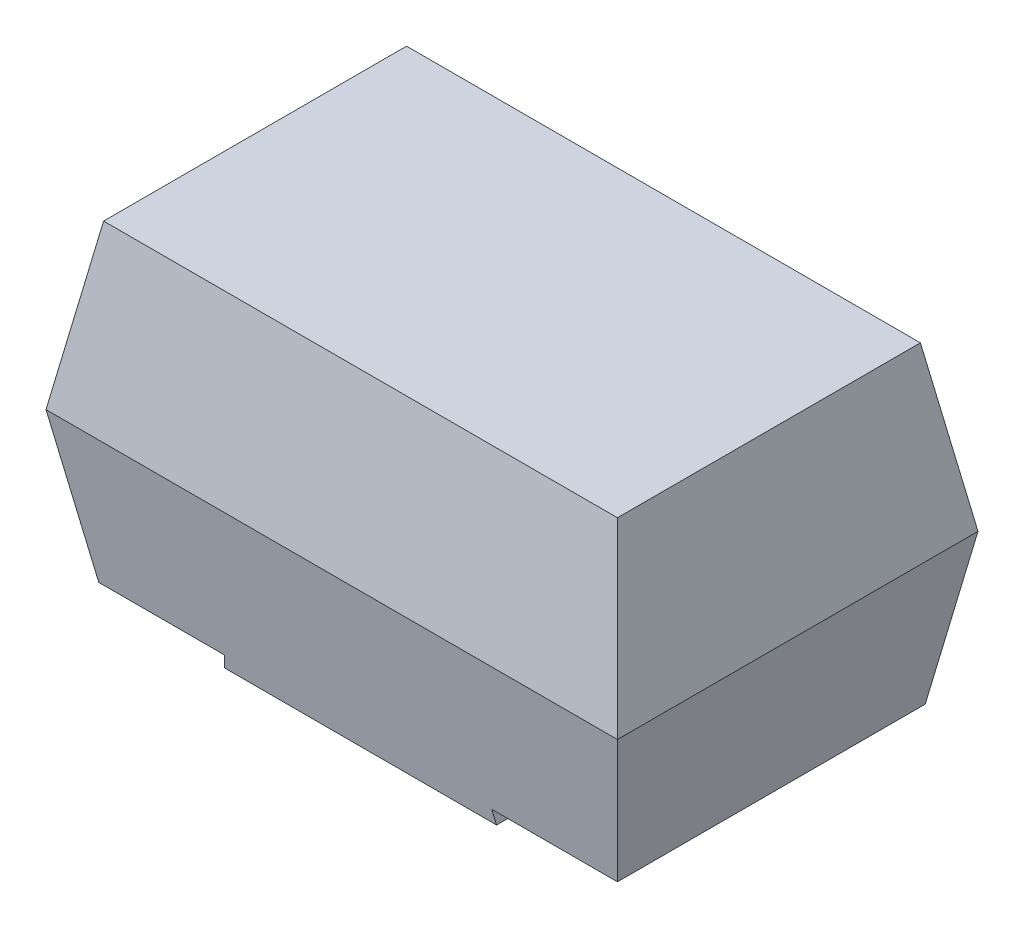
ISO-10303-21;
HEADER;
FILE_DESCRIPTION(('STEP AP214'),'2;1');
FILE_NAME('part.step','',(''),(''),'','','');
FILE_SCHEMA(('AUTOMOTIVE_DESIGN { 1 0 10303 214 1 1 1 1 }'));
ENDSEC;
DATA;
#1=APPLICATION_CONTEXT('core data for automotive mechanical design processes');
#2=APPLICATION_PROTOCOL_DEFINITION('international standard','automotive_design',2000,#1);
#3=PRODUCT_CONTEXT('',#1,'mechanical');
#4=PRODUCT('Part','Part','',(#3));
#5=PRODUCT_RELATED_PRODUCT_CATEGORY('part','',(#4));
#6=PRODUCT_DEFINITION_FORMATION('','',#4);
#7=PRODUCT_DEFINITION_CONTEXT('part definition',#1,'design');
#8=PRODUCT_DEFINITION('design','',#6,#7);
#9=PRODUCT_DEFINITION_SHAPE('','',#8);
#10=(LENGTH_UNIT() NAMED_UNIT(*) SI_UNIT(.MILLI.,.METRE.));
#11=(NAMED_UNIT(*) PLANE_ANGLE_UNIT() SI_UNIT($,.RADIAN.));
#12=(NAMED_UNIT(*) SI_UNIT($,.STERADIAN.) SOLID_ANGLE_UNIT());
#13=UNCERTAINTY_MEASURE_WITH_UNIT(LENGTH_MEASURE(1.E-05),#10,'distance_accuracy_value','');
#14=(GEOMETRIC_REPRESENTATION_CONTEXT(3) GLOBAL_UNCERTAINTY_ASSIGNED_CONTEXT((#13)) GLOBAL_UNIT_ASSIGNED_CONTEXT((#10,
#11,#12)) REPRESENTATION_CONTEXT('',''));
#15=CARTESIAN_POINT('',(0.,0.,0.));
#16=DIRECTION('',(0.,0.,1.));
#17=DIRECTION('',(1.,0.,0.));
#18=AXIS2_PLACEMENT_3D('',#15,#16,#17);
#19=CARTESIAN_POINT('',(0.,0.,0.));
#20=DIRECTION('',(-0.984807753012208,-0.173648177666931,0.));
#21=DIRECTION('',(0.173648177666931,-0.984807753012208,0.));
#22=AXIS2_PLACEMENT_3D('',#19,#20,#21);
#23=PLANE('',#22);
#24=DIRECTION('',(-0.171087869746036,0.970287525247814,-0.171087869746036));
#25=VECTOR('',#24,1.);
#26=CARTESIAN_POINT('',(0.,0.,-2.65));
#27=LINE('',#26,#25);
#28=CARTESIAN_POINT('',(0.193959678779312,-1.1,-2.45604032122069));
#29=VERTEX_POINT('',#28);
#30=CARTESIAN_POINT('',(0.,0.,-2.65));
#31=VERTEX_POINT('',#30);
#32=EDGE_CURVE('E11',#29,#31,#27,.T.);
#33=ORIENTED_EDGE('',*,*,#32,.F.);
#34=DIRECTION('',(0.,0.,-1.));
#35=VECTOR('',#34,1.);
#36=CARTESIAN_POINT('',(0.193959678779312,-1.1,-0.211592376850158));
#37=LINE('',#36,#35);
#38=CARTESIAN_POINT('',(0.193959678779312,-1.1,-0.193959678779312));
#39=VERTEX_POINT('',#38);
#40=EDGE_CURVE('E23',#39,#29,#37,.T.);
#41=ORIENTED_EDGE('',*,*,#40,.F.);
#42=DIRECTION('',(-0.171087869746036,0.970287525247814,0.171087869746036));
#43=VECTOR('',#42,1.);
#44=CARTESIAN_POINT('',(0.,0.,0.));
#45=LINE('',#44,#43);
#46=CARTESIAN_POINT('',(0.,0.,0.));
#47=VERTEX_POINT('',#46);
#48=EDGE_CURVE('E179',#39,#47,#45,.T.);
#49=ORIENTED_EDGE('',*,*,#48,.T.);
#50=DIRECTION('',(0.,0.,1.));
#51=VECTOR('',#50,1.);
#52=CARTESIAN_POINT('',(0.,0.,0.));
#53=LINE('',#52,#51);
#54=EDGE_CURVE('E176',#31,#47,#53,.T.);
#55=ORIENTED_EDGE('',*,*,#54,.F.);
#56=EDGE_LOOP('',(#33,#41,#49,#55));
#57=FACE_BOUND('',#56,.T.);
#58=ADVANCED_FACE('F16',(#57),#23,.T.);
#59=CARTESIAN_POINT('',(4.2,0.,0.));
#60=DIRECTION('',(0.984807753012208,-0.173648177666931,0.));
#61=DIRECTION('',(0.173648177666931,0.984807753012208,0.));
#62=AXIS2_PLACEMENT_3D('',#59,#60,#61);
#63=PLANE('',#62);
#64=DIRECTION('',(0.171087869746036,0.970287525247814,0.171087869746036));
#65=VECTOR('',#64,1.);
#66=CARTESIAN_POINT('',(4.07706155146821,-0.697218588090366,-0.122938448531794));
#67=LINE('',#66,#65);
#68=CARTESIAN_POINT('',(4.00604032122069,-1.1,-0.193959678779312));
#69=VERTEX_POINT('',#68);
#70=CARTESIAN_POINT('',(4.2,0.,0.));
#71=VERTEX_POINT('',#70);
#72=EDGE_CURVE('E174',#69,#71,#67,.T.);
#73=ORIENTED_EDGE('',*,*,#72,.F.);
#74=DIRECTION('',(0.,0.,1.));
#75=VECTOR('',#74,1.);
#76=CARTESIAN_POINT('',(4.00604032122069,-1.1,-0.211592376850158));
#77=LINE('',#76,#75);
#78=CARTESIAN_POINT('',(4.00604032122069,-1.1,-2.45604032122069));
#79=VERTEX_POINT('',#78);
#80=EDGE_CURVE('E106',#79,#69,#77,.T.);
#81=ORIENTED_EDGE('',*,*,#80,.F.);
#82=DIRECTION('',(0.171087869746036,0.970287525247814,-0.171087869746036));
#83=VECTOR('',#82,1.);
#84=CARTESIAN_POINT('',(4.12243169318828,-0.439911728199874,-2.57243169318827));
#85=LINE('',#84,#83);
#86=CARTESIAN_POINT('',(4.2,0.,-2.65));
#87=VERTEX_POINT('',#86);
#88=EDGE_CURVE('E171',#79,#87,#85,.T.);
#89=ORIENTED_EDGE('',*,*,#88,.T.);
#90=DIRECTION('',(0.,0.,-1.));
#91=VECTOR('',#90,1.);
#92=CARTESIAN_POINT('',(4.2,0.,0.));
#93=LINE('',#92,#91);
#94=EDGE_CURVE('E168',#71,#87,#93,.T.);
#95=ORIENTED_EDGE('',*,*,#94,.F.);
#96=EDGE_LOOP('',(#73,#81,#89,#95));
#97=FACE_BOUND('',#96,.T.);
#98=ADVANCED_FACE('F208',(#97),#63,.T.);
#99=CARTESIAN_POINT('',(0.,0.,0.));
#100=DIRECTION('',(-0.984807753012208,0.173648177666931,0.));
#101=DIRECTION('',(-0.173648177666931,-0.984807753012208,0.));
#102=AXIS2_PLACEMENT_3D('',#99,#100,#101);
#103=PLANE('',#102);
#104=ORIENTED_EDGE('',*,*,#54,.T.);
#105=DIRECTION('',(-0.171087869746036,-0.970287525247814,0.171087869746036));
#106=VECTOR('',#105,1.);
#107=CARTESIAN_POINT('',(0.,0.,0.));
#108=LINE('',#107,#106);
#109=CARTESIAN_POINT('',(0.211592376850158,1.2,-0.211592376850158));
#110=VERTEX_POINT('',#109);
#111=EDGE_CURVE('E165',#110,#47,#108,.T.);
#112=ORIENTED_EDGE('',*,*,#111,.F.);
#113=DIRECTION('',(0.,0.,1.));
#114=VECTOR('',#113,1.);
#115=CARTESIAN_POINT('',(0.21159237685016,1.2,-2.65));
#116=LINE('',#115,#114);
#117=CARTESIAN_POINT('',(0.21159237685016,1.2,-2.43840762314984));
#118=VERTEX_POINT('',#117);
#119=EDGE_CURVE('E162',#118,#110,#116,.T.);
#120=ORIENTED_EDGE('',*,*,#119,.F.);
#121=DIRECTION('',(-0.171087869746036,-0.970287525247814,-0.171087869746036));
#122=VECTOR('',#121,1.);
#123=CARTESIAN_POINT('',(0.0775683068117284,0.439911728199873,-2.57243169318827));
#124=LINE('',#123,#122);
#125=EDGE_CURVE('E159',#118,#31,#124,.T.);
#126=ORIENTED_EDGE('',*,*,#125,.T.);
#127=EDGE_LOOP('',(#104,#112,#120,#126));
#128=FACE_BOUND('',#127,.T.);
#129=ADVANCED_FACE('F192',(#128),#103,.T.);
#130=CARTESIAN_POINT('',(0.,0.,0.));
#131=DIRECTION('',(0.,0.173648177666931,0.984807753012208));
#132=DIRECTION('',(0.,-0.984807753012208,0.173648177666931));
#133=AXIS2_PLACEMENT_3D('',#130,#131,#132);
#134=PLANE('',#133);
#135=DIRECTION('',(1.,0.,0.));
#136=VECTOR('',#135,1.);
#137=CARTESIAN_POINT('',(0.,0.,0.));
#138=LINE('',#137,#136);
#139=EDGE_CURVE('E156',#47,#71,#138,.T.);
#140=ORIENTED_EDGE('',*,*,#139,.T.);
#141=DIRECTION('',(0.171087869746036,-0.970287525247814,0.171087869746036));
#142=VECTOR('',#141,1.);
#143=CARTESIAN_POINT('',(4.2,0.,0.));
#144=LINE('',#143,#142);
#145=CARTESIAN_POINT('',(3.98840762314984,1.2,-0.211592376850158));
#146=VERTEX_POINT('',#145);
#147=EDGE_CURVE('E153',#146,#71,#144,.T.);
#148=ORIENTED_EDGE('',*,*,#147,.F.);
#149=DIRECTION('',(1.,0.,0.));
#150=VECTOR('',#149,1.);
#151=CARTESIAN_POINT('',(0.,1.2,-0.211592376850159));
#152=LINE('',#151,#150);
#153=EDGE_CURVE('E150',#110,#146,#152,.T.);
#154=ORIENTED_EDGE('',*,*,#153,.F.);
#155=ORIENTED_EDGE('',*,*,#111,.T.);
#156=EDGE_LOOP('',(#140,#148,#154,#155));
#157=FACE_BOUND('',#156,.T.);
#158=ADVANCED_FACE('F196',(#157),#134,.T.);
#159=CARTESIAN_POINT('',(4.2,0.,0.));
#160=DIRECTION('',(0.984807753012208,0.173648177666931,0.));
#161=DIRECTION('',(-0.173648177666931,0.984807753012208,0.));
#162=AXIS2_PLACEMENT_3D('',#159,#160,#161);
#163=PLANE('',#162);
#164=ORIENTED_EDGE('',*,*,#94,.T.);
#165=DIRECTION('',(0.171087869746036,-0.970287525247814,-0.171087869746036));
#166=VECTOR('',#165,1.);
#167=CARTESIAN_POINT('',(4.07706155146821,0.697218588090366,-2.52706155146821));
#168=LINE('',#167,#166);
#169=CARTESIAN_POINT('',(3.98840762314984,1.2,-2.43840762314984));
#170=VERTEX_POINT('',#169);
#171=EDGE_CURVE('E147',#170,#87,#168,.T.);
#172=ORIENTED_EDGE('',*,*,#171,.F.);
#173=DIRECTION('',(0.,0.,-1.));
#174=VECTOR('',#173,1.);
#175=CARTESIAN_POINT('',(3.98840762314984,1.2,-2.65));
#176=LINE('',#175,#174);
#177=EDGE_CURVE('E144',#146,#170,#176,.T.);
#178=ORIENTED_EDGE('',*,*,#177,.F.);
#179=ORIENTED_EDGE('',*,*,#147,.T.);
#180=EDGE_LOOP('',(#164,#172,#178,#179));
#181=FACE_BOUND('',#180,.T.);
#182=ADVANCED_FACE('F202',(#181),#163,.T.);
#183=CARTESIAN_POINT('',(0.,0.,-2.65));
#184=DIRECTION('',(0.,0.173648177666931,-0.984807753012208));
#185=DIRECTION('',(0.,0.984807753012208,0.173648177666931));
#186=AXIS2_PLACEMENT_3D('',#183,#184,#185);
#187=PLANE('',#186);
#188=DIRECTION('',(-1.,0.,0.));
#189=VECTOR('',#188,1.);
#190=CARTESIAN_POINT('',(0.,0.,-2.65));
#191=LINE('',#190,#189);
#192=EDGE_CURVE('E141',#87,#31,#191,.T.);
#193=ORIENTED_EDGE('',*,*,#192,.T.);
#194=ORIENTED_EDGE('',*,*,#125,.F.);
#195=DIRECTION('',(-1.,0.,0.));
#196=VECTOR('',#195,1.);
#197=CARTESIAN_POINT('',(0.,1.2,-2.43840762314984));
#198=LINE('',#197,#196);
#199=EDGE_CURVE('E138',#170,#118,#198,.T.);
#200=ORIENTED_EDGE('',*,*,#199,.F.);
#201=ORIENTED_EDGE('',*,*,#171,.T.);
#202=EDGE_LOOP('',(#193,#194,#200,#201));
#203=FACE_BOUND('',#202,.T.);
#204=ADVANCED_FACE('F205',(#203),#187,.T.);
#205=CARTESIAN_POINT('',(0.,1.2,-2.65));
#206=DIRECTION('',(0.,-1.,0.));
#207=DIRECTION('',(0.,0.,-1.));
#208=AXIS2_PLACEMENT_3D('',#205,#206,#207);
#209=PLANE('',#208);
#210=ORIENTED_EDGE('',*,*,#119,.T.);
#211=ORIENTED_EDGE('',*,*,#153,.T.);
#212=ORIENTED_EDGE('',*,*,#177,.T.);
#213=ORIENTED_EDGE('',*,*,#199,.T.);
#214=EDGE_LOOP('',(#210,#211,#212,#213));
#215=FACE_BOUND('',#214,.T.);
#216=ADVANCED_FACE('F199',(#215),#209,.F.);
#217=CARTESIAN_POINT('',(0.,0.,-2.65));
#218=DIRECTION('',(0.,-0.173648177666931,-0.984807753012208));
#219=DIRECTION('',(0.,0.984807753012208,-0.173648177666931));
#220=AXIS2_PLACEMENT_3D('',#217,#218,#219);
#221=PLANE('',#220);
#222=DIRECTION('',(-0.171087869746036,-0.970287525247814,0.171087869746036));
#223=VECTOR('',#222,1.);
#224=CARTESIAN_POINT('',(1.1,-1.2,-2.43840762314984));
#225=LINE('',#224,#223);
#226=CARTESIAN_POINT('',(1.11763269807085,-1.1,-2.45604032122069));
#227=VERTEX_POINT('',#226);
#228=CARTESIAN_POINT('',(1.1,-1.2,-2.43840762314984));
#229=VERTEX_POINT('',#228);
#230=EDGE_CURVE('E136',#227,#229,#225,.T.);
#231=ORIENTED_EDGE('',*,*,#230,.F.);
#232=DIRECTION('',(1.,0.,0.));
#233=VECTOR('',#232,1.);
#234=CARTESIAN_POINT('',(1.1,-1.1,-2.45604032122069));
#235=LINE('',#234,#233);
#236=EDGE_CURVE('E133',#29,#227,#235,.T.);
#237=ORIENTED_EDGE('',*,*,#236,.F.);
#238=ORIENTED_EDGE('',*,*,#32,.T.);
#239=ORIENTED_EDGE('',*,*,#192,.F.);
#240=ORIENTED_EDGE('',*,*,#88,.F.);
#241=DIRECTION('',(1.,0.,0.));
#242=VECTOR('',#241,1.);
#243=CARTESIAN_POINT('',(3.98840762314984,-1.1,-2.45604032122069));
#244=LINE('',#243,#242);
#245=CARTESIAN_POINT('',(3.08236730192916,-1.1,-2.45604032122069));
#246=VERTEX_POINT('',#245);
#247=EDGE_CURVE('E131',#246,#79,#244,.T.);
#248=ORIENTED_EDGE('',*,*,#247,.F.);
#249=DIRECTION('',(0.171087869746036,-0.970287525247814,0.171087869746036));
#250=VECTOR('',#249,1.);
#251=CARTESIAN_POINT('',(3.1,-1.2,-2.43840762314984));
#252=LINE('',#251,#250);
#253=CARTESIAN_POINT('',(3.1,-1.2,-2.43840762314984));
#254=VERTEX_POINT('',#253);
#255=EDGE_CURVE('E111',#246,#254,#252,.T.);
#256=ORIENTED_EDGE('',*,*,#255,.T.);
#257=DIRECTION('',(-1.,0.,0.));
#258=VECTOR('',#257,1.);
#259=CARTESIAN_POINT('',(0.,-1.2,-2.43840762314984));
#260=LINE('',#259,#258);
#261=EDGE_CURVE('E127',#254,#229,#260,.T.);
#262=ORIENTED_EDGE('',*,*,#261,.T.);
#263=EDGE_LOOP('',(#231,#237,#238,#239,#240,#248,#256,#262));
#264=FACE_BOUND('',#263,.T.);
#265=ADVANCED_FACE('F185',(#264),#221,.T.);
#266=CARTESIAN_POINT('',(0.,0.,0.));
#267=DIRECTION('',(0.,-0.173648177666931,0.984807753012208));
#268=DIRECTION('',(0.,-0.984807753012208,-0.173648177666931));
#269=AXIS2_PLACEMENT_3D('',#266,#267,#268);
#270=PLANE('',#269);
#271=DIRECTION('',(-0.171087869746036,-0.970287525247814,-0.171087869746036));
#272=VECTOR('',#271,1.);
#273=CARTESIAN_POINT('',(1.03481875915547,-1.56966118618171,-0.276773617694689));
#274=LINE('',#273,#272);
#275=CARTESIAN_POINT('',(1.11763269807085,-1.1,-0.193959678779312));
#276=VERTEX_POINT('',#275);
#277=CARTESIAN_POINT('',(1.1,-1.2,-0.211592376850158));
#278=VERTEX_POINT('',#277);
#279=EDGE_CURVE('E125',#276,#278,#274,.T.);
#280=ORIENTED_EDGE('',*,*,#279,.T.);
#281=DIRECTION('',(1.,0.,0.));
#282=VECTOR('',#281,1.);
#283=CARTESIAN_POINT('',(0.,-1.2,-0.211592376850158));
#284=LINE('',#283,#282);
#285=CARTESIAN_POINT('',(3.1,-1.2,-0.211592376850158));
#286=VERTEX_POINT('',#285);
#287=EDGE_CURVE('E94',#278,#286,#284,.T.);
#288=ORIENTED_EDGE('',*,*,#287,.T.);
#289=DIRECTION('',(0.171087869746036,-0.970287525247814,-0.171087869746036));
#290=VECTOR('',#289,1.);
#291=CARTESIAN_POINT('',(3.12600463210806,-1.3474795973003,-0.23759700895822));
#292=LINE('',#291,#290);
#293=CARTESIAN_POINT('',(3.08236730192916,-1.1,-0.193959678779312));
#294=VERTEX_POINT('',#293);
#295=EDGE_CURVE('E89',#294,#286,#292,.T.);
#296=ORIENTED_EDGE('',*,*,#295,.F.);
#297=DIRECTION('',(-1.,0.,0.));
#298=VECTOR('',#297,1.);
#299=CARTESIAN_POINT('',(3.98840762314984,-1.1,-0.193959678779312));
#300=LINE('',#299,#298);
#301=EDGE_CURVE('E92',#69,#294,#300,.T.);
#302=ORIENTED_EDGE('',*,*,#301,.F.);
#303=ORIENTED_EDGE('',*,*,#72,.T.);
#304=ORIENTED_EDGE('',*,*,#139,.F.);
#305=ORIENTED_EDGE('',*,*,#48,.F.);
#306=DIRECTION('',(-1.,0.,0.));
#307=VECTOR('',#306,1.);
#308=CARTESIAN_POINT('',(1.1,-1.1,-0.193959678779312));
#309=LINE('',#308,#307);
#310=EDGE_CURVE('E107',#276,#39,#309,.T.);
#311=ORIENTED_EDGE('',*,*,#310,.F.);
#312=EDGE_LOOP('',(#280,#288,#296,#302,#303,#304,#305,#311));
#313=FACE_BOUND('',#312,.T.);
#314=ADVANCED_FACE('F91',(#313),#270,.T.);
#315=CARTESIAN_POINT('',(0.,-1.2,-2.65));
#316=DIRECTION('',(0.,-1.,0.));
#317=DIRECTION('',(0.,0.,-1.));
#318=AXIS2_PLACEMENT_3D('',#315,#316,#317);
#319=PLANE('',#318);
#320=DIRECTION('',(0.,0.,1.));
#321=VECTOR('',#320,1.);
#322=CARTESIAN_POINT('',(1.1,-1.2,-2.43840762314984));
#323=LINE('',#322,#321);
#324=EDGE_CURVE('E115',#229,#278,#323,.T.);
#325=ORIENTED_EDGE('',*,*,#324,.F.);
#326=ORIENTED_EDGE('',*,*,#261,.F.);
#327=DIRECTION('',(0.,0.,-1.));
#328=VECTOR('',#327,1.);
#329=CARTESIAN_POINT('',(3.1,-1.2,-2.43840762314984));
#330=LINE('',#329,#328);
#331=EDGE_CURVE('E112',#286,#254,#330,.T.);
#332=ORIENTED_EDGE('',*,*,#331,.F.);
#333=ORIENTED_EDGE('',*,*,#287,.F.);
#334=EDGE_LOOP('',(#325,#326,#332,#333));
#335=FACE_BOUND('',#334,.T.);
#336=ADVANCED_FACE('F229',(#335),#319,.T.);
#337=CARTESIAN_POINT('',(3.1,-1.2,-2.43840762314984));
#338=DIRECTION('',(-0.984807753012208,-0.173648177666931,0.));
#339=DIRECTION('',(0.173648177666931,-0.984807753012208,0.));
#340=AXIS2_PLACEMENT_3D('',#337,#338,#339);
#341=PLANE('',#340);
#342=ORIENTED_EDGE('',*,*,#331,.T.);
#343=ORIENTED_EDGE('',*,*,#255,.F.);
#344=DIRECTION('',(0.,0.,-1.));
#345=VECTOR('',#344,1.);
#346=CARTESIAN_POINT('',(3.08236730192916,-1.1,-0.211592376850158));
#347=LINE('',#346,#345);
#348=EDGE_CURVE('E105',#294,#246,#347,.T.);
#349=ORIENTED_EDGE('',*,*,#348,.F.);
#350=ORIENTED_EDGE('',*,*,#295,.T.);
#351=EDGE_LOOP('',(#342,#343,#349,#350));
#352=FACE_BOUND('',#351,.T.);
#353=ADVANCED_FACE('F110',(#352),#341,.F.);
#354=CARTESIAN_POINT('',(3.98840762314984,-1.1,-0.211592376850158));
#355=DIRECTION('',(0.,-1.,0.));
#356=DIRECTION('',(0.,0.,-1.));
#357=AXIS2_PLACEMENT_3D('',#354,#355,#356);
#358=PLANE('',#357);
#359=ORIENTED_EDGE('',*,*,#80,.T.);
#360=ORIENTED_EDGE('',*,*,#301,.T.);
#361=ORIENTED_EDGE('',*,*,#348,.T.);
#362=ORIENTED_EDGE('',*,*,#247,.T.);
#363=EDGE_LOOP('',(#359,#360,#361,#362));
#364=FACE_BOUND('',#363,.T.);
#365=ADVANCED_FACE('F103',(#364),#358,.T.);
#366=CARTESIAN_POINT('',(1.1,-1.2,-2.43840762314984));
#367=DIRECTION('',(0.984807753012208,-0.173648177666931,0.));
#368=DIRECTION('',(0.173648177666931,0.984807753012208,0.));
#369=AXIS2_PLACEMENT_3D('',#366,#367,#368);
#370=PLANE('',#369);
#371=ORIENTED_EDGE('',*,*,#324,.T.);
#372=ORIENTED_EDGE('',*,*,#279,.F.);
#373=DIRECTION('',(0.,0.,1.));
#374=VECTOR('',#373,1.);
#375=CARTESIAN_POINT('',(1.11763269807085,-1.1,-0.211592376850158));
#376=LINE('',#375,#374);
#377=EDGE_CURVE('E113',#227,#276,#376,.T.);
#378=ORIENTED_EDGE('',*,*,#377,.F.);
#379=ORIENTED_EDGE('',*,*,#230,.T.);
#380=EDGE_LOOP('',(#371,#372,#378,#379));
#381=FACE_BOUND('',#380,.T.);
#382=ADVANCED_FACE('F189',(#381),#370,.F.);
#383=CARTESIAN_POINT('',(1.1,-1.1,-0.211592376850158));
#384=DIRECTION('',(0.,-1.,0.));
#385=DIRECTION('',(0.,0.,-1.));
#386=AXIS2_PLACEMENT_3D('',#383,#384,#385);
#387=PLANE('',#386);
#388=ORIENTED_EDGE('',*,*,#377,.T.);
#389=ORIENTED_EDGE('',*,*,#310,.T.);
#390=ORIENTED_EDGE('',*,*,#40,.T.);
#391=ORIENTED_EDGE('',*,*,#236,.T.);
#392=EDGE_LOOP('',(#388,#389,#390,#391));
#393=FACE_BOUND('',#392,.T.);
#394=ADVANCED_FACE('F181',(#393),#387,.T.);
#395=CLOSED_SHELL('',(#58,#98,#129,#158,#182,#204,#216,#265,#314,#336,#353,#365,#382,#394));
#396=MANIFOLD_SOLID_BREP('B1',#395);
#397=ADVANCED_BREP_SHAPE_REPRESENTATION('',(#18,#396),#14);
#398=SHAPE_DEFINITION_REPRESENTATION(#9,#397);
ENDSEC;
END-ISO-10303-21;
